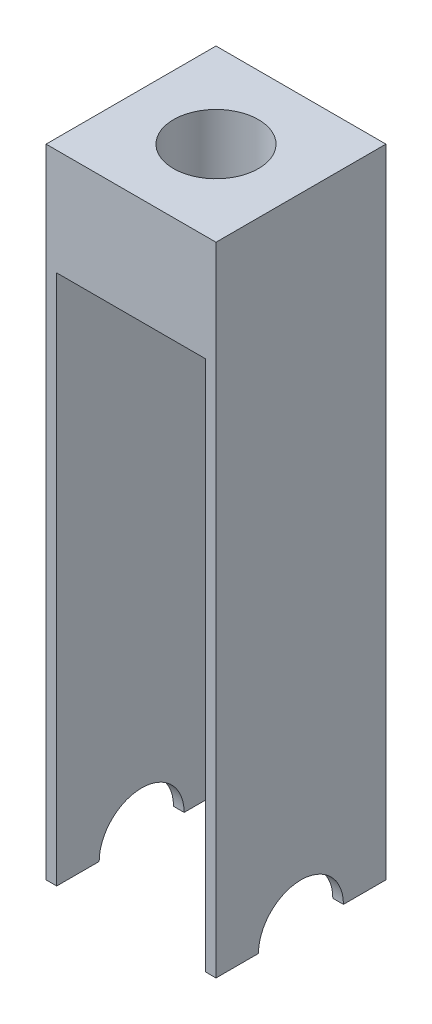
ISO-10303-21;
HEADER;
FILE_DESCRIPTION(('STEP AP214'),'2;1');
FILE_NAME('part.step','',(''),(''),'','','');
FILE_SCHEMA(('AUTOMOTIVE_DESIGN { 1 0 10303 214 1 1 1 1 }'));
ENDSEC;
DATA;
#1=APPLICATION_CONTEXT('core data for automotive mechanical design processes');
#2=APPLICATION_PROTOCOL_DEFINITION('international standard','automotive_design',2000,#1);
#3=PRODUCT_CONTEXT('',#1,'mechanical');
#4=PRODUCT('Part','Part','',(#3));
#5=PRODUCT_RELATED_PRODUCT_CATEGORY('part','',(#4));
#6=PRODUCT_DEFINITION_FORMATION('','',#4);
#7=PRODUCT_DEFINITION_CONTEXT('part definition',#1,'design');
#8=PRODUCT_DEFINITION('design','',#6,#7);
#9=PRODUCT_DEFINITION_SHAPE('','',#8);
#10=(LENGTH_UNIT() NAMED_UNIT(*) SI_UNIT(.MILLI.,.METRE.));
#11=(NAMED_UNIT(*) PLANE_ANGLE_UNIT() SI_UNIT($,.RADIAN.));
#12=(NAMED_UNIT(*) SI_UNIT($,.STERADIAN.) SOLID_ANGLE_UNIT());
#13=UNCERTAINTY_MEASURE_WITH_UNIT(LENGTH_MEASURE(1.E-05),#10,'distance_accuracy_value','');
#14=(GEOMETRIC_REPRESENTATION_CONTEXT(3) GLOBAL_UNCERTAINTY_ASSIGNED_CONTEXT((#13)) GLOBAL_UNIT_ASSIGNED_CONTEXT((#10,
#11,#12)) REPRESENTATION_CONTEXT('',''));
#15=CARTESIAN_POINT('',(0.,0.,0.));
#16=DIRECTION('',(0.,0.,1.));
#17=DIRECTION('',(1.,0.,0.));
#18=AXIS2_PLACEMENT_3D('',#15,#16,#17);
#19=CARTESIAN_POINT('',(80.,-150.,20.));
#20=DIRECTION('',(0.,1.,0.));
#21=DIRECTION('',(0.,0.,1.));
#22=AXIS2_PLACEMENT_3D('',#19,#20,#21);
#23=PLANE('',#22);
#24=DIRECTION('',(-1.,0.,0.));
#25=VECTOR('',#24,1.);
#26=CARTESIAN_POINT('',(80.,-150.,20.));
#27=LINE('',#26,#25);
#28=CARTESIAN_POINT('',(5.00000000000004,-150.,20.));
#29=VERTEX_POINT('',#28);
#30=CARTESIAN_POINT('',(0.,-150.,20.));
#31=VERTEX_POINT('',#30);
#32=EDGE_CURVE('E152',#29,#31,#27,.T.);
#33=ORIENTED_EDGE('',*,*,#32,.F.);
#34=DIRECTION('',(0.,0.,1.));
#35=VECTOR('',#34,1.);
#36=CARTESIAN_POINT('',(5.00000000000004,-150.,-40.));
#37=LINE('',#36,#35);
#38=CARTESIAN_POINT('',(5.00000000000004,-150.,40.));
#39=VERTEX_POINT('',#38);
#40=EDGE_CURVE('E209',#29,#39,#37,.T.);
#41=ORIENTED_EDGE('',*,*,#40,.T.);
#42=DIRECTION('',(-1.,0.,0.));
#43=VECTOR('',#42,1.);
#44=CARTESIAN_POINT('',(80.,-150.,40.));
#45=LINE('',#44,#43);
#46=CARTESIAN_POINT('',(0.,-150.,40.));
#47=VERTEX_POINT('',#46);
#48=EDGE_CURVE('E41',#39,#47,#45,.T.);
#49=ORIENTED_EDGE('',*,*,#48,.T.);
#50=DIRECTION('',(0.,0.,-1.));
#51=VECTOR('',#50,1.);
#52=CARTESIAN_POINT('',(0.,-150.,20.));
#53=LINE('',#52,#51);
#54=EDGE_CURVE('E135',#47,#31,#53,.T.);
#55=ORIENTED_EDGE('',*,*,#54,.T.);
#56=EDGE_LOOP('',(#33,#41,#49,#55));
#57=FACE_BOUND('',#56,.T.);
#58=ADVANCED_FACE('F33',(#57),#23,.F.);
#59=CARTESIAN_POINT('',(80.,-150.,0.));
#60=DIRECTION('',(-1.,0.,0.));
#61=DIRECTION('',(0.,0.,1.));
#62=AXIS2_PLACEMENT_3D('',#59,#60,#61);
#63=CYLINDRICAL_SURFACE('',#62,20.);
#64=DIRECTION('',(-1.,0.,0.));
#65=VECTOR('',#64,1.);
#66=CARTESIAN_POINT('',(80.,-150.,-20.));
#67=LINE('',#66,#65);
#68=CARTESIAN_POINT('',(5.00000000000004,-150.,-20.));
#69=VERTEX_POINT('',#68);
#70=CARTESIAN_POINT('',(0.,-150.,-20.));
#71=VERTEX_POINT('',#70);
#72=EDGE_CURVE('E122',#69,#71,#67,.T.);
#73=ORIENTED_EDGE('',*,*,#72,.F.);
#74=CARTESIAN_POINT('',(5.00000000000005,-150.,0.));
#75=DIRECTION('',(-1.,0.,0.));
#76=DIRECTION('',(0.,-1.,0.));
#77=AXIS2_PLACEMENT_3D('',#74,#75,#76);
#78=CIRCLE('',#77,20.);
#79=EDGE_CURVE('E136',#69,#29,#78,.F.);
#80=ORIENTED_EDGE('',*,*,#79,.T.);
#81=ORIENTED_EDGE('',*,*,#32,.T.);
#82=CARTESIAN_POINT('',(0.,-150.,0.));
#83=DIRECTION('',(-1.,0.,0.));
#84=DIRECTION('',(0.,0.,-1.));
#85=AXIS2_PLACEMENT_3D('',#82,#83,#84);
#86=CIRCLE('',#85,20.);
#87=EDGE_CURVE('E139',#31,#71,#86,.T.);
#88=ORIENTED_EDGE('',*,*,#87,.T.);
#89=EDGE_LOOP('',(#73,#80,#81,#88));
#90=FACE_BOUND('',#89,.T.);
#91=ADVANCED_FACE('F161',(#90),#63,.F.);
#92=CARTESIAN_POINT('',(80.,-150.,-40.));
#93=DIRECTION('',(0.,1.,0.));
#94=DIRECTION('',(0.,0.,1.));
#95=AXIS2_PLACEMENT_3D('',#92,#93,#94);
#96=PLANE('',#95);
#97=DIRECTION('',(-1.,0.,0.));
#98=VECTOR('',#97,1.);
#99=CARTESIAN_POINT('',(80.,-150.,-40.));
#100=LINE('',#99,#98);
#101=CARTESIAN_POINT('',(5.00000000000004,-150.,-40.));
#102=VERTEX_POINT('',#101);
#103=CARTESIAN_POINT('',(0.,-150.,-40.));
#104=VERTEX_POINT('',#103);
#105=EDGE_CURVE('E123',#102,#104,#100,.T.);
#106=ORIENTED_EDGE('',*,*,#105,.F.);
#107=EDGE_CURVE('E181',#102,#69,#37,.T.);
#108=ORIENTED_EDGE('',*,*,#107,.T.);
#109=ORIENTED_EDGE('',*,*,#72,.T.);
#110=DIRECTION('',(0.,0.,-1.));
#111=VECTOR('',#110,1.);
#112=CARTESIAN_POINT('',(0.,-150.,-40.));
#113=LINE('',#112,#111);
#114=EDGE_CURVE('E142',#71,#104,#113,.T.);
#115=ORIENTED_EDGE('',*,*,#114,.T.);
#116=EDGE_LOOP('',(#106,#108,#109,#115));
#117=FACE_BOUND('',#116,.T.);
#118=ADVANCED_FACE('F176',(#117),#96,.F.);
#119=CARTESIAN_POINT('',(80.,-150.,40.));
#120=DIRECTION('',(0.,0.,-1.));
#121=DIRECTION('',(-1.,0.,0.));
#122=AXIS2_PLACEMENT_3D('',#119,#120,#121);
#123=PLANE('',#122);
#124=ORIENTED_EDGE('',*,*,#48,.F.);
#125=DIRECTION('',(0.,-1.,0.));
#126=VECTOR('',#125,1.);
#127=CARTESIAN_POINT('',(5.,100.,40.));
#128=LINE('',#127,#126);
#129=CARTESIAN_POINT('',(5.,100.,40.));
#130=VERTEX_POINT('',#129);
#131=EDGE_CURVE('E226',#130,#39,#128,.T.);
#132=ORIENTED_EDGE('',*,*,#131,.F.);
#133=DIRECTION('',(-1.,0.,0.));
#134=VECTOR('',#133,1.);
#135=CARTESIAN_POINT('',(5.,100.,40.));
#136=LINE('',#135,#134);
#137=CARTESIAN_POINT('',(75.,100.,40.));
#138=VERTEX_POINT('',#137);
#139=EDGE_CURVE('E223',#138,#130,#136,.T.);
#140=ORIENTED_EDGE('',*,*,#139,.F.);
#141=DIRECTION('',(0.,1.,0.));
#142=VECTOR('',#141,1.);
#143=CARTESIAN_POINT('',(75.,100.,40.));
#144=LINE('',#143,#142);
#145=CARTESIAN_POINT('',(75.,-150.,40.));
#146=VERTEX_POINT('',#145);
#147=EDGE_CURVE('E219',#146,#138,#144,.T.);
#148=ORIENTED_EDGE('',*,*,#147,.F.);
#149=CARTESIAN_POINT('',(80.,-150.,40.));
#150=VERTEX_POINT('',#149);
#151=EDGE_CURVE('E11',#150,#146,#45,.T.);
#152=ORIENTED_EDGE('',*,*,#151,.F.);
#153=DIRECTION('',(0.,-1.,0.));
#154=VECTOR('',#153,1.);
#155=CARTESIAN_POINT('',(80.,-150.,40.));
#156=LINE('',#155,#154);
#157=CARTESIAN_POINT('',(80.,150.,40.));
#158=VERTEX_POINT('',#157);
#159=EDGE_CURVE('E148',#158,#150,#156,.T.);
#160=ORIENTED_EDGE('',*,*,#159,.F.);
#161=DIRECTION('',(-1.,0.,0.));
#162=VECTOR('',#161,1.);
#163=CARTESIAN_POINT('',(80.,150.,40.));
#164=LINE('',#163,#162);
#165=CARTESIAN_POINT('',(0.,150.,40.));
#166=VERTEX_POINT('',#165);
#167=EDGE_CURVE('E128',#158,#166,#164,.T.);
#168=ORIENTED_EDGE('',*,*,#167,.T.);
#169=DIRECTION('',(0.,-1.,0.));
#170=VECTOR('',#169,1.);
#171=CARTESIAN_POINT('',(0.,-150.,40.));
#172=LINE('',#171,#170);
#173=EDGE_CURVE('E132',#166,#47,#172,.T.);
#174=ORIENTED_EDGE('',*,*,#173,.T.);
#175=EDGE_LOOP('',(#124,#132,#140,#148,#152,#160,#168,#174));
#176=FACE_BOUND('',#175,.T.);
#177=ADVANCED_FACE('F35',(#176),#123,.F.);
#178=ORIENTED_EDGE('',*,*,#151,.T.);
#179=DIRECTION('',(0.,0.,1.));
#180=VECTOR('',#179,1.);
#181=CARTESIAN_POINT('',(75.,-150.,-40.));
#182=LINE('',#181,#180);
#183=CARTESIAN_POINT('',(75.,-150.,20.));
#184=VERTEX_POINT('',#183);
#185=EDGE_CURVE('E201',#184,#146,#182,.T.);
#186=ORIENTED_EDGE('',*,*,#185,.F.);
#187=CARTESIAN_POINT('',(80.,-150.,20.));
#188=VERTEX_POINT('',#187);
#189=EDGE_CURVE('E153',#188,#184,#27,.T.);
#190=ORIENTED_EDGE('',*,*,#189,.F.);
#191=DIRECTION('',(0.,0.,-1.));
#192=VECTOR('',#191,1.);
#193=CARTESIAN_POINT('',(80.,-150.,20.));
#194=LINE('',#193,#192);
#195=EDGE_CURVE('E92',#150,#188,#194,.T.);
#196=ORIENTED_EDGE('',*,*,#195,.F.);
#197=EDGE_LOOP('',(#178,#186,#190,#196));
#198=FACE_BOUND('',#197,.T.);
#199=ADVANCED_FACE('F205',(#198),#23,.F.);
#200=ORIENTED_EDGE('',*,*,#189,.T.);
#201=CARTESIAN_POINT('',(75.,-150.,0.));
#202=DIRECTION('',(1.,0.,0.));
#203=DIRECTION('',(0.,1.,0.));
#204=AXIS2_PLACEMENT_3D('',#201,#202,#203);
#205=CIRCLE('',#204,20.);
#206=CARTESIAN_POINT('',(75.,-150.,-20.));
#207=VERTEX_POINT('',#206);
#208=EDGE_CURVE('E196',#184,#207,#205,.F.);
#209=ORIENTED_EDGE('',*,*,#208,.T.);
#210=CARTESIAN_POINT('',(80.,-150.,-20.));
#211=VERTEX_POINT('',#210);
#212=EDGE_CURVE('E151',#211,#207,#67,.T.);
#213=ORIENTED_EDGE('',*,*,#212,.F.);
#214=CARTESIAN_POINT('',(80.,-150.,0.));
#215=DIRECTION('',(-1.,0.,0.));
#216=DIRECTION('',(0.,0.,-1.));
#217=AXIS2_PLACEMENT_3D('',#214,#215,#216);
#218=CIRCLE('',#217,20.);
#219=EDGE_CURVE('E108',#188,#211,#218,.T.);
#220=ORIENTED_EDGE('',*,*,#219,.F.);
#221=EDGE_LOOP('',(#200,#209,#213,#220));
#222=FACE_BOUND('',#221,.T.);
#223=ADVANCED_FACE('F271',(#222),#63,.F.);
#224=ORIENTED_EDGE('',*,*,#212,.T.);
#225=CARTESIAN_POINT('',(75.,-150.,-40.));
#226=VERTEX_POINT('',#225);
#227=EDGE_CURVE('E119',#226,#207,#182,.T.);
#228=ORIENTED_EDGE('',*,*,#227,.F.);
#229=CARTESIAN_POINT('',(80.,-150.,-40.));
#230=VERTEX_POINT('',#229);
#231=EDGE_CURVE('E115',#230,#226,#100,.T.);
#232=ORIENTED_EDGE('',*,*,#231,.F.);
#233=DIRECTION('',(0.,0.,-1.));
#234=VECTOR('',#233,1.);
#235=CARTESIAN_POINT('',(80.,-150.,-40.));
#236=LINE('',#235,#234);
#237=EDGE_CURVE('E101',#211,#230,#236,.T.);
#238=ORIENTED_EDGE('',*,*,#237,.F.);
#239=EDGE_LOOP('',(#224,#228,#232,#238));
#240=FACE_BOUND('',#239,.T.);
#241=ADVANCED_FACE('F116',(#240),#96,.F.);
#242=CARTESIAN_POINT('',(80.,-150.,-40.));
#243=DIRECTION('',(0.,0.,1.));
#244=DIRECTION('',(1.,0.,0.));
#245=AXIS2_PLACEMENT_3D('',#242,#243,#244);
#246=PLANE('',#245);
#247=DIRECTION('',(-1.,0.,0.));
#248=VECTOR('',#247,1.);
#249=CARTESIAN_POINT('',(5.,100.,-40.));
#250=LINE('',#249,#248);
#251=CARTESIAN_POINT('',(75.,100.,-40.));
#252=VERTEX_POINT('',#251);
#253=CARTESIAN_POINT('',(5.,100.,-40.));
#254=VERTEX_POINT('',#253);
#255=EDGE_CURVE('E48',#252,#254,#250,.T.);
#256=ORIENTED_EDGE('',*,*,#255,.T.);
#257=DIRECTION('',(0.,-1.,0.));
#258=VECTOR('',#257,1.);
#259=CARTESIAN_POINT('',(5.,100.,-40.));
#260=LINE('',#259,#258);
#261=EDGE_CURVE('E228',#254,#102,#260,.T.);
#262=ORIENTED_EDGE('',*,*,#261,.T.);
#263=ORIENTED_EDGE('',*,*,#105,.T.);
#264=DIRECTION('',(0.,1.,0.));
#265=VECTOR('',#264,1.);
#266=CARTESIAN_POINT('',(0.,-150.,-40.));
#267=LINE('',#266,#265);
#268=CARTESIAN_POINT('',(0.,150.,-40.));
#269=VERTEX_POINT('',#268);
#270=EDGE_CURVE('E145',#104,#269,#267,.T.);
#271=ORIENTED_EDGE('',*,*,#270,.T.);
#272=DIRECTION('',(-1.,0.,0.));
#273=VECTOR('',#272,1.);
#274=CARTESIAN_POINT('',(80.,150.,-40.));
#275=LINE('',#274,#273);
#276=CARTESIAN_POINT('',(80.,150.,-40.));
#277=VERTEX_POINT('',#276);
#278=EDGE_CURVE('E126',#277,#269,#275,.T.);
#279=ORIENTED_EDGE('',*,*,#278,.F.);
#280=DIRECTION('',(0.,1.,0.));
#281=VECTOR('',#280,1.);
#282=CARTESIAN_POINT('',(80.,-150.,-40.));
#283=LINE('',#282,#281);
#284=EDGE_CURVE('E105',#230,#277,#283,.T.);
#285=ORIENTED_EDGE('',*,*,#284,.F.);
#286=ORIENTED_EDGE('',*,*,#231,.T.);
#287=DIRECTION('',(0.,1.,0.));
#288=VECTOR('',#287,1.);
#289=CARTESIAN_POINT('',(75.,100.,-40.));
#290=LINE('',#289,#288);
#291=EDGE_CURVE('E237',#226,#252,#290,.T.);
#292=ORIENTED_EDGE('',*,*,#291,.T.);
#293=EDGE_LOOP('',(#256,#262,#263,#271,#279,#285,#286,#292));
#294=FACE_BOUND('',#293,.T.);
#295=ADVANCED_FACE('F125',(#294),#246,.F.);
#296=CARTESIAN_POINT('',(80.,150.,-40.));
#297=DIRECTION('',(0.,-1.,0.));
#298=DIRECTION('',(0.,0.,-1.));
#299=AXIS2_PLACEMENT_3D('',#296,#297,#298);
#300=PLANE('',#299);
#301=CARTESIAN_POINT('',(40.,150.,0.));
#302=DIRECTION('',(0.,1.,0.));
#303=DIRECTION('',(0.,0.,1.));
#304=AXIS2_PLACEMENT_3D('',#301,#302,#303);
#305=CIRCLE('',#304,20.);
#306=CARTESIAN_POINT('',(40.,150.,20.));
#307=VERTEX_POINT('',#306);
#308=EDGE_CURVE('E242',#307,#307,#305,.T.);
#309=ORIENTED_EDGE('',*,*,#308,.F.);
#310=EDGE_LOOP('',(#309));
#311=FACE_BOUND('',#310,.T.);
#312=DIRECTION('',(0.,0.,1.));
#313=VECTOR('',#312,1.);
#314=CARTESIAN_POINT('',(0.,150.,-40.));
#315=LINE('',#314,#313);
#316=EDGE_CURVE('E84',#269,#166,#315,.T.);
#317=ORIENTED_EDGE('',*,*,#316,.T.);
#318=ORIENTED_EDGE('',*,*,#167,.F.);
#319=DIRECTION('',(0.,0.,1.));
#320=VECTOR('',#319,1.);
#321=CARTESIAN_POINT('',(80.,150.,-40.));
#322=LINE('',#321,#320);
#323=EDGE_CURVE('E57',#277,#158,#322,.T.);
#324=ORIENTED_EDGE('',*,*,#323,.F.);
#325=ORIENTED_EDGE('',*,*,#278,.T.);
#326=EDGE_LOOP('',(#317,#318,#324,#325));
#327=FACE_BOUND('',#326,.T.);
#328=ADVANCED_FACE('F256',(#311,#327),#300,.F.);
#329=CARTESIAN_POINT('',(80.,-150.,0.));
#330=DIRECTION('',(1.,0.,0.));
#331=DIRECTION('',(0.,0.,-1.));
#332=AXIS2_PLACEMENT_3D('',#329,#330,#331);
#333=PLANE('',#332);
#334=ORIENTED_EDGE('',*,*,#159,.T.);
#335=ORIENTED_EDGE('',*,*,#195,.T.);
#336=ORIENTED_EDGE('',*,*,#219,.T.);
#337=ORIENTED_EDGE('',*,*,#237,.T.);
#338=ORIENTED_EDGE('',*,*,#284,.T.);
#339=ORIENTED_EDGE('',*,*,#323,.T.);
#340=EDGE_LOOP('',(#334,#335,#336,#337,#338,#339));
#341=FACE_BOUND('',#340,.T.);
#342=ADVANCED_FACE('F103',(#341),#333,.T.);
#343=CARTESIAN_POINT('',(0.,-150.,0.));
#344=DIRECTION('',(1.,0.,0.));
#345=DIRECTION('',(0.,0.,-1.));
#346=AXIS2_PLACEMENT_3D('',#343,#344,#345);
#347=PLANE('',#346);
#348=ORIENTED_EDGE('',*,*,#173,.F.);
#349=ORIENTED_EDGE('',*,*,#316,.F.);
#350=ORIENTED_EDGE('',*,*,#270,.F.);
#351=ORIENTED_EDGE('',*,*,#114,.F.);
#352=ORIENTED_EDGE('',*,*,#87,.F.);
#353=ORIENTED_EDGE('',*,*,#54,.F.);
#354=EDGE_LOOP('',(#348,#349,#350,#351,#352,#353));
#355=FACE_BOUND('',#354,.T.);
#356=ADVANCED_FACE('F172',(#355),#347,.F.);
#357=CARTESIAN_POINT('',(5.,100.,-40.));
#358=DIRECTION('',(-1.,0.,0.));
#359=DIRECTION('',(0.,-1.,0.));
#360=AXIS2_PLACEMENT_3D('',#357,#358,#359);
#361=PLANE('',#360);
#362=ORIENTED_EDGE('',*,*,#107,.F.);
#363=ORIENTED_EDGE('',*,*,#261,.F.);
#364=DIRECTION('',(0.,0.,1.));
#365=VECTOR('',#364,1.);
#366=CARTESIAN_POINT('',(5.,100.,-40.));
#367=LINE('',#366,#365);
#368=EDGE_CURVE('E203',#254,#130,#367,.T.);
#369=ORIENTED_EDGE('',*,*,#368,.T.);
#370=ORIENTED_EDGE('',*,*,#131,.T.);
#371=ORIENTED_EDGE('',*,*,#40,.F.);
#372=ORIENTED_EDGE('',*,*,#79,.F.);
#373=EDGE_LOOP('',(#362,#363,#369,#370,#371,#372));
#374=FACE_BOUND('',#373,.T.);
#375=ADVANCED_FACE('F298',(#374),#361,.F.);
#376=CARTESIAN_POINT('',(75.,100.,-40.));
#377=DIRECTION('',(1.,0.,0.));
#378=DIRECTION('',(0.,1.,0.));
#379=AXIS2_PLACEMENT_3D('',#376,#377,#378);
#380=PLANE('',#379);
#381=ORIENTED_EDGE('',*,*,#185,.T.);
#382=ORIENTED_EDGE('',*,*,#147,.T.);
#383=DIRECTION('',(0.,0.,1.));
#384=VECTOR('',#383,1.);
#385=CARTESIAN_POINT('',(75.,100.,-40.));
#386=LINE('',#385,#384);
#387=EDGE_CURVE('E208',#252,#138,#386,.T.);
#388=ORIENTED_EDGE('',*,*,#387,.F.);
#389=ORIENTED_EDGE('',*,*,#291,.F.);
#390=ORIENTED_EDGE('',*,*,#227,.T.);
#391=ORIENTED_EDGE('',*,*,#208,.F.);
#392=EDGE_LOOP('',(#381,#382,#388,#389,#390,#391));
#393=FACE_BOUND('',#392,.T.);
#394=ADVANCED_FACE('F198',(#393),#380,.F.);
#395=CARTESIAN_POINT('',(5.,100.,-40.));
#396=DIRECTION('',(0.,1.,0.));
#397=DIRECTION('',(-1.,0.,0.));
#398=AXIS2_PLACEMENT_3D('',#395,#396,#397);
#399=PLANE('',#398);
#400=ORIENTED_EDGE('',*,*,#139,.T.);
#401=ORIENTED_EDGE('',*,*,#368,.F.);
#402=ORIENTED_EDGE('',*,*,#255,.F.);
#403=ORIENTED_EDGE('',*,*,#387,.T.);
#404=EDGE_LOOP('',(#400,#401,#402,#403));
#405=FACE_BOUND('',#404,.T.);
#406=ADVANCED_FACE('F236',(#405),#399,.F.);
#407=CARTESIAN_POINT('',(40.,110.,0.));
#408=DIRECTION('',(0.,1.,0.));
#409=DIRECTION('',(0.,0.,1.));
#410=AXIS2_PLACEMENT_3D('',#407,#408,#409);
#411=CYLINDRICAL_SURFACE('',#410,20.);
#412=CARTESIAN_POINT('',(40.,110.,0.));
#413=DIRECTION('',(0.,1.,0.));
#414=DIRECTION('',(0.,0.,1.));
#415=AXIS2_PLACEMENT_3D('',#412,#413,#414);
#416=CIRCLE('',#415,20.);
#417=CARTESIAN_POINT('',(40.,110.,20.));
#418=VERTEX_POINT('',#417);
#419=EDGE_CURVE('E231',#418,#418,#416,.T.);
#420=ORIENTED_EDGE('',*,*,#419,.F.);
#421=EDGE_LOOP('',(#420));
#422=FACE_BOUND('',#421,.T.);
#423=ORIENTED_EDGE('',*,*,#308,.T.);
#424=EDGE_LOOP('',(#423));
#425=FACE_BOUND('',#424,.T.);
#426=ADVANCED_FACE('F250',(#422,#425),#411,.F.);
#427=CARTESIAN_POINT('',(40.,110.,0.));
#428=DIRECTION('',(0.,1.,0.));
#429=DIRECTION('',(0.,0.,1.));
#430=AXIS2_PLACEMENT_3D('',#427,#428,#429);
#431=PLANE('',#430);
#432=ORIENTED_EDGE('',*,*,#419,.T.);
#433=EDGE_LOOP('',(#432));
#434=FACE_BOUND('',#433,.T.);
#435=ADVANCED_FACE('F248',(#434),#431,.T.);
#436=CLOSED_SHELL('',(#58,#91,#118,#177,#199,#223,#241,#295,#328,#342,#356,#375,#394,#406,#426,#435));
#437=MANIFOLD_SOLID_BREP('B2',#436);
#438=ADVANCED_BREP_SHAPE_REPRESENTATION('',(#18,#437),#14);
#439=SHAPE_DEFINITION_REPRESENTATION(#9,#438);
ENDSEC;
END-ISO-10303-21;
